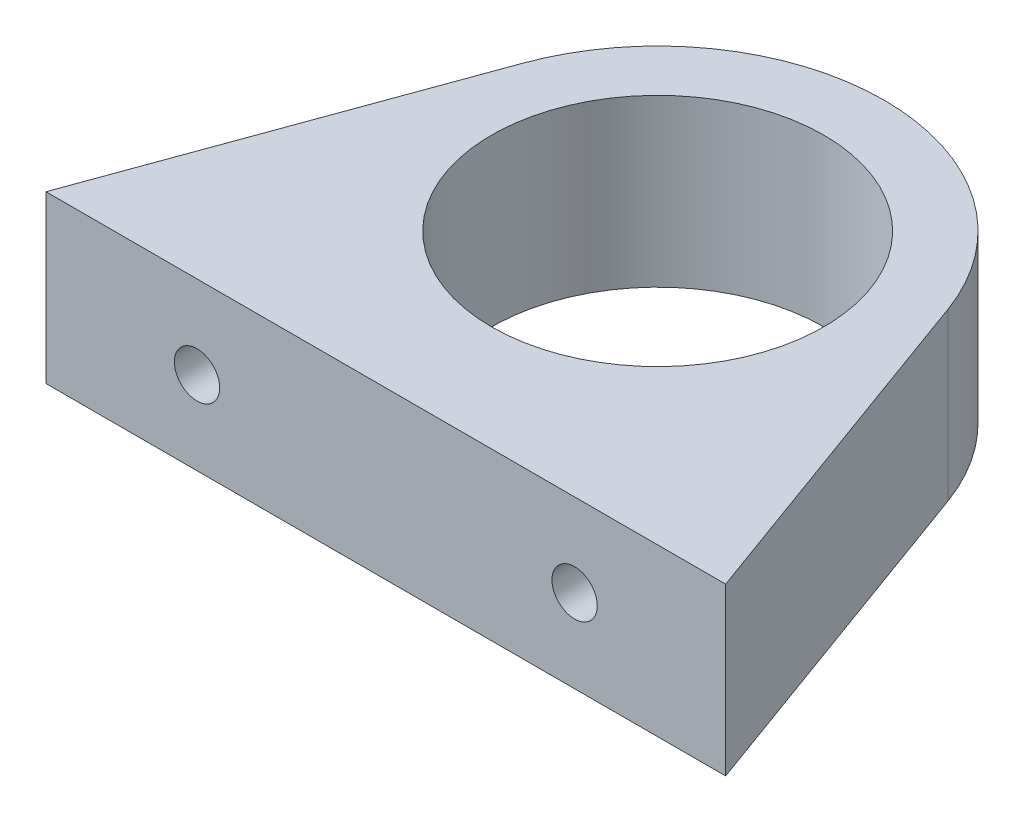
ISO-10303-21;
HEADER;
FILE_DESCRIPTION(('STEP AP214'),'2;1');
FILE_NAME('part.step','',(''),(''),'','','');
FILE_SCHEMA(('AUTOMOTIVE_DESIGN { 1 0 10303 214 1 1 1 1 }'));
ENDSEC;
DATA;
#1=APPLICATION_CONTEXT('core data for automotive mechanical design processes');
#2=APPLICATION_PROTOCOL_DEFINITION('international standard','automotive_design',2000,#1);
#3=PRODUCT_CONTEXT('',#1,'mechanical');
#4=PRODUCT('Part','Part','',(#3));
#5=PRODUCT_RELATED_PRODUCT_CATEGORY('part','',(#4));
#6=PRODUCT_DEFINITION_FORMATION('','',#4);
#7=PRODUCT_DEFINITION_CONTEXT('part definition',#1,'design');
#8=PRODUCT_DEFINITION('design','',#6,#7);
#9=PRODUCT_DEFINITION_SHAPE('','',#8);
#10=(LENGTH_UNIT() NAMED_UNIT(*) SI_UNIT(.MILLI.,.METRE.));
#11=(NAMED_UNIT(*) PLANE_ANGLE_UNIT() SI_UNIT($,.RADIAN.));
#12=(NAMED_UNIT(*) SI_UNIT($,.STERADIAN.) SOLID_ANGLE_UNIT());
#13=UNCERTAINTY_MEASURE_WITH_UNIT(LENGTH_MEASURE(1.E-05),#10,'distance_accuracy_value','');
#14=(GEOMETRIC_REPRESENTATION_CONTEXT(3) GLOBAL_UNCERTAINTY_ASSIGNED_CONTEXT((#13)) GLOBAL_UNIT_ASSIGNED_CONTEXT((#10,
#11,#12)) REPRESENTATION_CONTEXT('',''));
#15=CARTESIAN_POINT('',(0.,0.,0.));
#16=DIRECTION('',(0.,0.,1.));
#17=DIRECTION('',(1.,0.,0.));
#18=AXIS2_PLACEMENT_3D('',#15,#16,#17);
#19=CARTESIAN_POINT('',(0.,11.,0.));
#20=DIRECTION('',(0.,1.,0.));
#21=DIRECTION('',(0.,0.,1.));
#22=AXIS2_PLACEMENT_3D('',#19,#20,#21);
#23=PLANE('',#22);
#24=CARTESIAN_POINT('',(0.,11.,0.));
#25=DIRECTION('',(0.,1.,0.));
#26=DIRECTION('',(0.,0.,1.));
#27=AXIS2_PLACEMENT_3D('',#24,#25,#26);
#28=CIRCLE('',#27,15.);
#29=CARTESIAN_POINT('',(14.0981558374911,11.,-5.12269479686386));
#30=VERTEX_POINT('',#29);
#31=CARTESIAN_POINT('',(-14.0981558374911,11.,-5.12269479686385));
#32=VERTEX_POINT('',#31);
#33=EDGE_CURVE('E11',#30,#32,#28,.T.);
#34=ORIENTED_EDGE('',*,*,#33,.T.);
#35=DIRECTION('',(-0.34151298645759,0.,0.939877055832739));
#36=VECTOR('',#35,1.);
#37=CARTESIAN_POINT('',(-22.5,11.,18.));
#38=LINE('',#37,#36);
#39=CARTESIAN_POINT('',(-22.5,11.,18.));
#40=VERTEX_POINT('',#39);
#41=EDGE_CURVE('E107',#32,#40,#38,.T.);
#42=ORIENTED_EDGE('',*,*,#41,.T.);
#43=DIRECTION('',(1.,0.,0.));
#44=VECTOR('',#43,1.);
#45=CARTESIAN_POINT('',(-22.5,11.,18.));
#46=LINE('',#45,#44);
#47=CARTESIAN_POINT('',(22.5,11.,18.));
#48=VERTEX_POINT('',#47);
#49=EDGE_CURVE('E118',#40,#48,#46,.T.);
#50=ORIENTED_EDGE('',*,*,#49,.T.);
#51=DIRECTION('',(-0.34151298645759,0.,-0.939877055832739));
#52=VECTOR('',#51,1.);
#53=CARTESIAN_POINT('',(22.5,11.,18.));
#54=LINE('',#53,#52);
#55=EDGE_CURVE('E53',#48,#30,#54,.T.);
#56=ORIENTED_EDGE('',*,*,#55,.T.);
#57=EDGE_LOOP('',(#34,#42,#50,#56));
#58=FACE_BOUND('',#57,.T.);
#59=CARTESIAN_POINT('',(0.,11.,0.));
#60=DIRECTION('',(0.,1.,0.));
#61=DIRECTION('',(0.,0.,1.));
#62=AXIS2_PLACEMENT_3D('',#59,#60,#61);
#63=CIRCLE('',#62,11.);
#64=CARTESIAN_POINT('',(0.,11.,11.));
#65=VERTEX_POINT('',#64);
#66=EDGE_CURVE('E127',#65,#65,#63,.T.);
#67=ORIENTED_EDGE('',*,*,#66,.F.);
#68=EDGE_LOOP('',(#67));
#69=FACE_BOUND('',#68,.T.);
#70=ADVANCED_FACE('F39',(#58,#69),#23,.T.);
#71=CARTESIAN_POINT('',(0.,0.,0.));
#72=DIRECTION('',(0.,1.,0.));
#73=DIRECTION('',(0.,0.,1.));
#74=AXIS2_PLACEMENT_3D('',#71,#72,#73);
#75=PLANE('',#74);
#76=CARTESIAN_POINT('',(0.,0.,0.));
#77=DIRECTION('',(0.,1.,0.));
#78=DIRECTION('',(0.,0.,1.));
#79=AXIS2_PLACEMENT_3D('',#76,#77,#78);
#80=CIRCLE('',#79,15.);
#81=CARTESIAN_POINT('',(14.0981558374911,0.,-5.12269479686386));
#82=VERTEX_POINT('',#81);
#83=CARTESIAN_POINT('',(-14.0981558374911,0.,-5.12269479686385));
#84=VERTEX_POINT('',#83);
#85=EDGE_CURVE('E43',#82,#84,#80,.T.);
#86=ORIENTED_EDGE('',*,*,#85,.F.);
#87=DIRECTION('',(-0.34151298645759,0.,-0.939877055832739));
#88=VECTOR('',#87,1.);
#89=CARTESIAN_POINT('',(22.5,0.,18.));
#90=LINE('',#89,#88);
#91=CARTESIAN_POINT('',(22.5,0.,18.));
#92=VERTEX_POINT('',#91);
#93=EDGE_CURVE('E109',#92,#82,#90,.T.);
#94=ORIENTED_EDGE('',*,*,#93,.F.);
#95=DIRECTION('',(1.,0.,0.));
#96=VECTOR('',#95,1.);
#97=CARTESIAN_POINT('',(-22.5,0.,18.));
#98=LINE('',#97,#96);
#99=CARTESIAN_POINT('',(-22.5,0.,18.));
#100=VERTEX_POINT('',#99);
#101=EDGE_CURVE('E113',#100,#92,#98,.T.);
#102=ORIENTED_EDGE('',*,*,#101,.F.);
#103=DIRECTION('',(-0.34151298645759,0.,0.939877055832739));
#104=VECTOR('',#103,1.);
#105=CARTESIAN_POINT('',(-22.5,0.,18.));
#106=LINE('',#105,#104);
#107=EDGE_CURVE('E105',#84,#100,#106,.T.);
#108=ORIENTED_EDGE('',*,*,#107,.F.);
#109=EDGE_LOOP('',(#86,#94,#102,#108));
#110=FACE_BOUND('',#109,.T.);
#111=CARTESIAN_POINT('',(0.,0.,0.));
#112=DIRECTION('',(0.,1.,0.));
#113=DIRECTION('',(0.,0.,1.));
#114=AXIS2_PLACEMENT_3D('',#111,#112,#113);
#115=CIRCLE('',#114,11.);
#116=CARTESIAN_POINT('',(0.,0.,11.));
#117=VERTEX_POINT('',#116);
#118=EDGE_CURVE('E117',#117,#117,#115,.T.);
#119=ORIENTED_EDGE('',*,*,#118,.T.);
#120=EDGE_LOOP('',(#119));
#121=FACE_BOUND('',#120,.T.);
#122=ADVANCED_FACE('F133',(#110,#121),#75,.F.);
#123=CARTESIAN_POINT('',(0.,11.,0.));
#124=DIRECTION('',(0.,-1.,0.));
#125=DIRECTION('',(0.,0.,-1.));
#126=AXIS2_PLACEMENT_3D('',#123,#124,#125);
#127=CYLINDRICAL_SURFACE('',#126,15.);
#128=ORIENTED_EDGE('',*,*,#33,.F.);
#129=DIRECTION('',(0.,-1.,0.));
#130=VECTOR('',#129,1.);
#131=CARTESIAN_POINT('',(14.0981558374911,61.5930727933075,-5.12269479686386));
#132=LINE('',#131,#130);
#133=EDGE_CURVE('E111',#30,#82,#132,.T.);
#134=ORIENTED_EDGE('',*,*,#133,.T.);
#135=ORIENTED_EDGE('',*,*,#85,.T.);
#136=DIRECTION('',(0.,-1.,0.));
#137=VECTOR('',#136,1.);
#138=CARTESIAN_POINT('',(-14.0981558374911,61.5930727933075,-5.12269479686385));
#139=LINE('',#138,#137);
#140=EDGE_CURVE('E108',#32,#84,#139,.T.);
#141=ORIENTED_EDGE('',*,*,#140,.F.);
#142=EDGE_LOOP('',(#128,#134,#135,#141));
#143=FACE_BOUND('',#142,.T.);
#144=ADVANCED_FACE('F41',(#143),#127,.T.);
#145=CARTESIAN_POINT('',(0.,11.,0.));
#146=DIRECTION('',(0.,-1.,0.));
#147=DIRECTION('',(0.,0.,-1.));
#148=AXIS2_PLACEMENT_3D('',#145,#146,#147);
#149=CYLINDRICAL_SURFACE('',#148,11.);
#150=ORIENTED_EDGE('',*,*,#66,.T.);
#151=EDGE_LOOP('',(#150));
#152=FACE_BOUND('',#151,.T.);
#153=ORIENTED_EDGE('',*,*,#118,.F.);
#154=EDGE_LOOP('',(#153));
#155=FACE_BOUND('',#154,.T.);
#156=ADVANCED_FACE('F135',(#152,#155),#149,.F.);
#157=CARTESIAN_POINT('',(-22.5,61.5930727933075,18.));
#158=DIRECTION('',(0.,0.,-1.));
#159=DIRECTION('',(-1.,0.,0.));
#160=AXIS2_PLACEMENT_3D('',#157,#158,#159);
#161=PLANE('',#160);
#162=CARTESIAN_POINT('',(-12.5,5.5,18.));
#163=DIRECTION('',(0.,0.,1.));
#164=DIRECTION('',(1.,0.,0.));
#165=AXIS2_PLACEMENT_3D('',#162,#163,#164);
#166=CIRCLE('',#165,1.5);
#167=CARTESIAN_POINT('',(-11.,5.5,18.));
#168=VERTEX_POINT('',#167);
#169=EDGE_CURVE('E95',#168,#168,#166,.T.);
#170=ORIENTED_EDGE('',*,*,#169,.F.);
#171=EDGE_LOOP('',(#170));
#172=FACE_BOUND('',#171,.T.);
#173=CARTESIAN_POINT('',(12.5,5.5,18.));
#174=DIRECTION('',(0.,0.,1.));
#175=DIRECTION('',(1.,0.,0.));
#176=AXIS2_PLACEMENT_3D('',#173,#174,#175);
#177=CIRCLE('',#176,1.5);
#178=CARTESIAN_POINT('',(14.,5.5,18.));
#179=VERTEX_POINT('',#178);
#180=EDGE_CURVE('E94',#179,#179,#177,.T.);
#181=ORIENTED_EDGE('',*,*,#180,.F.);
#182=EDGE_LOOP('',(#181));
#183=FACE_BOUND('',#182,.T.);
#184=ORIENTED_EDGE('',*,*,#49,.F.);
#185=DIRECTION('',(0.,-1.,0.));
#186=VECTOR('',#185,1.);
#187=CARTESIAN_POINT('',(-22.5,61.5930727933075,18.));
#188=LINE('',#187,#186);
#189=EDGE_CURVE('E61',#40,#100,#188,.T.);
#190=ORIENTED_EDGE('',*,*,#189,.T.);
#191=ORIENTED_EDGE('',*,*,#101,.T.);
#192=DIRECTION('',(0.,-1.,0.));
#193=VECTOR('',#192,1.);
#194=CARTESIAN_POINT('',(22.5,61.5930727933075,18.));
#195=LINE('',#194,#193);
#196=EDGE_CURVE('E112',#48,#92,#195,.T.);
#197=ORIENTED_EDGE('',*,*,#196,.F.);
#198=EDGE_LOOP('',(#184,#190,#191,#197));
#199=FACE_BOUND('',#198,.T.);
#200=ADVANCED_FACE('F137',(#172,#183,#199),#161,.F.);
#201=CARTESIAN_POINT('',(22.5,61.5930727933075,18.));
#202=DIRECTION('',(-0.939877055832739,0.,0.34151298645759));
#203=DIRECTION('',(0.34151298645759,0.,0.939877055832739));
#204=AXIS2_PLACEMENT_3D('',#201,#202,#203);
#205=PLANE('',#204);
#206=ORIENTED_EDGE('',*,*,#55,.F.);
#207=ORIENTED_EDGE('',*,*,#196,.T.);
#208=ORIENTED_EDGE('',*,*,#93,.T.);
#209=ORIENTED_EDGE('',*,*,#133,.F.);
#210=EDGE_LOOP('',(#206,#207,#208,#209));
#211=FACE_BOUND('',#210,.T.);
#212=ADVANCED_FACE('F144',(#211),#205,.F.);
#213=CARTESIAN_POINT('',(-22.5,61.5930727933075,18.));
#214=DIRECTION('',(0.939877055832739,0.,0.34151298645759));
#215=DIRECTION('',(0.34151298645759,0.,-0.939877055832739));
#216=AXIS2_PLACEMENT_3D('',#213,#214,#215);
#217=PLANE('',#216);
#218=ORIENTED_EDGE('',*,*,#41,.F.);
#219=ORIENTED_EDGE('',*,*,#140,.T.);
#220=ORIENTED_EDGE('',*,*,#107,.T.);
#221=ORIENTED_EDGE('',*,*,#189,.F.);
#222=EDGE_LOOP('',(#218,#219,#220,#221));
#223=FACE_BOUND('',#222,.T.);
#224=ADVANCED_FACE('F161',(#223),#217,.F.);
#225=CARTESIAN_POINT('',(12.5,5.5,8.90129092854134));
#226=DIRECTION('',(0.,0.,1.));
#227=DIRECTION('',(1.,0.,0.));
#228=AXIS2_PLACEMENT_3D('',#225,#226,#227);
#229=CONICAL_SURFACE('',#228,1.5,1.02974425867665);
#230=CARTESIAN_POINT('',(12.5,5.5,8.));
#231=VERTEX_POINT('',#230);
#232=VERTEX_LOOP('',#231);
#233=FACE_BOUND('',#232,.T.);
#234=CARTESIAN_POINT('',(12.5,5.5,8.90129092854134));
#235=DIRECTION('',(0.,0.,1.));
#236=DIRECTION('',(1.,0.,0.));
#237=AXIS2_PLACEMENT_3D('',#234,#235,#236);
#238=CIRCLE('',#237,1.5);
#239=CARTESIAN_POINT('',(14.,5.5,8.90129092854134));
#240=VERTEX_POINT('',#239);
#241=EDGE_CURVE('E98',#240,#240,#238,.T.);
#242=ORIENTED_EDGE('',*,*,#241,.T.);
#243=EDGE_LOOP('',(#242));
#244=FACE_BOUND('',#243,.T.);
#245=ADVANCED_FACE('F172',(#233,#244),#229,.F.);
#246=CARTESIAN_POINT('',(12.5,5.5,18.));
#247=DIRECTION('',(0.,0.,1.));
#248=DIRECTION('',(1.,0.,0.));
#249=AXIS2_PLACEMENT_3D('',#246,#247,#248);
#250=CYLINDRICAL_SURFACE('',#249,1.5);
#251=ORIENTED_EDGE('',*,*,#241,.F.);
#252=EDGE_LOOP('',(#251));
#253=FACE_BOUND('',#252,.T.);
#254=ORIENTED_EDGE('',*,*,#180,.T.);
#255=EDGE_LOOP('',(#254));
#256=FACE_BOUND('',#255,.T.);
#257=ADVANCED_FACE('F88',(#253,#256),#250,.F.);
#258=CARTESIAN_POINT('',(-12.5,5.5,8.90129092854134));
#259=DIRECTION('',(0.,0.,1.));
#260=DIRECTION('',(1.,0.,0.));
#261=AXIS2_PLACEMENT_3D('',#258,#259,#260);
#262=CONICAL_SURFACE('',#261,1.5,1.02974425867665);
#263=CARTESIAN_POINT('',(-12.5,5.5,8.));
#264=VERTEX_POINT('',#263);
#265=VERTEX_LOOP('',#264);
#266=FACE_BOUND('',#265,.T.);
#267=CARTESIAN_POINT('',(-12.5,5.5,8.90129092854134));
#268=DIRECTION('',(0.,0.,1.));
#269=DIRECTION('',(1.,0.,0.));
#270=AXIS2_PLACEMENT_3D('',#267,#268,#269);
#271=CIRCLE('',#270,1.5);
#272=CARTESIAN_POINT('',(-11.,5.5,8.90129092854134));
#273=VERTEX_POINT('',#272);
#274=EDGE_CURVE('E92',#273,#273,#271,.T.);
#275=ORIENTED_EDGE('',*,*,#274,.T.);
#276=EDGE_LOOP('',(#275));
#277=FACE_BOUND('',#276,.T.);
#278=ADVANCED_FACE('F84',(#266,#277),#262,.F.);
#279=CARTESIAN_POINT('',(-12.5,5.5,18.));
#280=DIRECTION('',(0.,0.,1.));
#281=DIRECTION('',(1.,0.,0.));
#282=AXIS2_PLACEMENT_3D('',#279,#280,#281);
#283=CYLINDRICAL_SURFACE('',#282,1.5);
#284=ORIENTED_EDGE('',*,*,#274,.F.);
#285=EDGE_LOOP('',(#284));
#286=FACE_BOUND('',#285,.T.);
#287=ORIENTED_EDGE('',*,*,#169,.T.);
#288=EDGE_LOOP('',(#287));
#289=FACE_BOUND('',#288,.T.);
#290=ADVANCED_FACE('F87',(#286,#289),#283,.F.);
#291=CLOSED_SHELL('',(#70,#122,#144,#156,#200,#212,#224,#245,#257,#278,#290));
#292=MANIFOLD_SOLID_BREP('B2',#291);
#293=ADVANCED_BREP_SHAPE_REPRESENTATION('',(#18,#292),#14);
#294=SHAPE_DEFINITION_REPRESENTATION(#9,#293);
ENDSEC;
END-ISO-10303-21;
